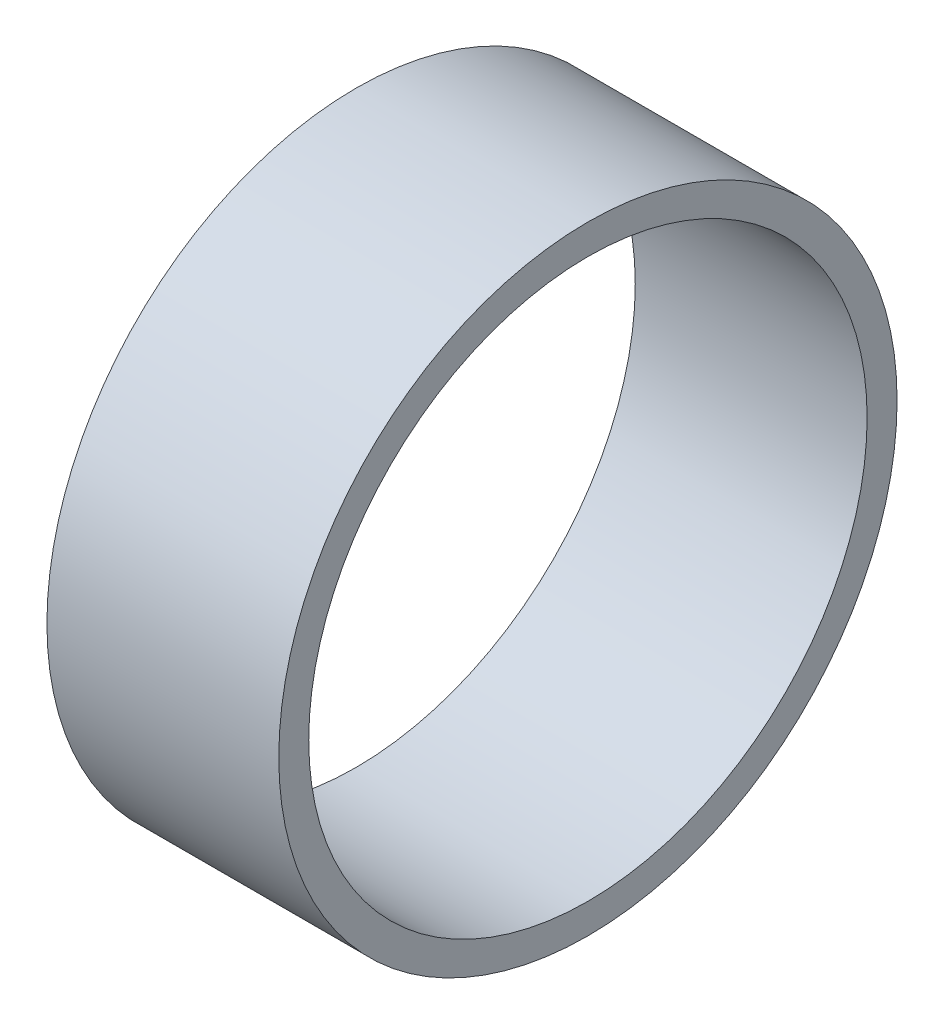
ISO-10303-21;
HEADER;
FILE_DESCRIPTION(('STEP AP214'),'2;1');
FILE_NAME('part.step','',(''),(''),'','','');
FILE_SCHEMA(('AUTOMOTIVE_DESIGN { 1 0 10303 214 1 1 1 1 }'));
ENDSEC;
DATA;
#1=APPLICATION_CONTEXT('core data for automotive mechanical design processes');
#2=APPLICATION_PROTOCOL_DEFINITION('international standard','automotive_design',2000,#1);
#3=PRODUCT_CONTEXT('',#1,'mechanical');
#4=PRODUCT('Part','Part','',(#3));
#5=PRODUCT_RELATED_PRODUCT_CATEGORY('part','',(#4));
#6=PRODUCT_DEFINITION_FORMATION('','',#4);
#7=PRODUCT_DEFINITION_CONTEXT('part definition',#1,'design');
#8=PRODUCT_DEFINITION('design','',#6,#7);
#9=PRODUCT_DEFINITION_SHAPE('','',#8);
#10=(LENGTH_UNIT() NAMED_UNIT(*) SI_UNIT(.MILLI.,.METRE.));
#11=(NAMED_UNIT(*) PLANE_ANGLE_UNIT() SI_UNIT($,.RADIAN.));
#12=(NAMED_UNIT(*) SI_UNIT($,.STERADIAN.) SOLID_ANGLE_UNIT());
#13=UNCERTAINTY_MEASURE_WITH_UNIT(LENGTH_MEASURE(1.E-05),#10,'distance_accuracy_value','');
#14=(GEOMETRIC_REPRESENTATION_CONTEXT(3) GLOBAL_UNCERTAINTY_ASSIGNED_CONTEXT((#13)) GLOBAL_UNIT_ASSIGNED_CONTEXT((#10,
#11,#12)) REPRESENTATION_CONTEXT('',''));
#15=CARTESIAN_POINT('',(0.,0.,0.));
#16=DIRECTION('',(0.,0.,1.));
#17=DIRECTION('',(1.,0.,0.));
#18=AXIS2_PLACEMENT_3D('',#15,#16,#17);
#19=CARTESIAN_POINT('',(0.,0.,0.));
#20=DIRECTION('',(1.,0.,0.));
#21=DIRECTION('',(0.,1.,0.));
#22=AXIS2_PLACEMENT_3D('',#19,#20,#21);
#23=PLANE('',#22);
#24=CARTESIAN_POINT('',(0.,0.,0.));
#25=DIRECTION('',(-1.,0.,0.));
#26=DIRECTION('',(0.,-1.,0.));
#27=AXIS2_PLACEMENT_3D('',#24,#25,#26);
#28=CIRCLE('',#27,14.45);
#29=CARTESIAN_POINT('',(0.,14.45,0.));
#30=VERTEX_POINT('',#29);
#31=EDGE_CURVE('E59',#30,#30,#28,.T.);
#32=ORIENTED_EDGE('',*,*,#31,.F.);
#33=EDGE_LOOP('',(#32));
#34=FACE_BOUND('',#33,.T.);
#35=CARTESIAN_POINT('',(0.,0.,0.));
#36=DIRECTION('',(1.,0.,0.));
#37=DIRECTION('',(0.,1.,0.));
#38=AXIS2_PLACEMENT_3D('',#35,#36,#37);
#39=CIRCLE('',#38,16.);
#40=CARTESIAN_POINT('',(0.,-16.,0.));
#41=VERTEX_POINT('',#40);
#42=EDGE_CURVE('E11',#41,#41,#39,.T.);
#43=ORIENTED_EDGE('',*,*,#42,.F.);
#44=EDGE_LOOP('',(#43));
#45=FACE_BOUND('',#44,.T.);
#46=ADVANCED_FACE('F17',(#34,#45),#23,.F.);
#47=CARTESIAN_POINT('',(12.,0.,0.));
#48=DIRECTION('',(1.,0.,0.));
#49=DIRECTION('',(0.,1.,0.));
#50=AXIS2_PLACEMENT_3D('',#47,#48,#49);
#51=PLANE('',#50);
#52=CARTESIAN_POINT('',(12.,0.,0.));
#53=DIRECTION('',(-1.,0.,0.));
#54=DIRECTION('',(0.,-1.,0.));
#55=AXIS2_PLACEMENT_3D('',#52,#53,#54);
#56=CIRCLE('',#55,14.45);
#57=CARTESIAN_POINT('',(12.,14.45,0.));
#58=VERTEX_POINT('',#57);
#59=EDGE_CURVE('E57',#58,#58,#56,.T.);
#60=ORIENTED_EDGE('',*,*,#59,.T.);
#61=EDGE_LOOP('',(#60));
#62=FACE_BOUND('',#61,.T.);
#63=CARTESIAN_POINT('',(12.,0.,0.));
#64=DIRECTION('',(1.,0.,0.));
#65=DIRECTION('',(0.,1.,0.));
#66=AXIS2_PLACEMENT_3D('',#63,#64,#65);
#67=CIRCLE('',#66,16.);
#68=CARTESIAN_POINT('',(12.,-16.,0.));
#69=VERTEX_POINT('',#68);
#70=EDGE_CURVE('E71',#69,#69,#67,.T.);
#71=ORIENTED_EDGE('',*,*,#70,.T.);
#72=EDGE_LOOP('',(#71));
#73=FACE_BOUND('',#72,.T.);
#74=ADVANCED_FACE('F62',(#62,#73),#51,.T.);
#75=CARTESIAN_POINT('',(0.,0.,0.));
#76=DIRECTION('',(1.,0.,0.));
#77=DIRECTION('',(0.,1.,0.));
#78=AXIS2_PLACEMENT_3D('',#75,#76,#77);
#79=CYLINDRICAL_SURFACE('',#78,16.);
#80=ORIENTED_EDGE('',*,*,#70,.F.);
#81=DIRECTION('',(-1.,0.,0.));
#82=VECTOR('',#81,1.);
#83=CARTESIAN_POINT('',(0.,-16.,0.));
#84=LINE('',#83,#82);
#85=EDGE_CURVE('E27',#69,#41,#84,.T.);
#86=ORIENTED_EDGE('',*,*,#85,.T.);
#87=ORIENTED_EDGE('',*,*,#42,.T.);
#88=ORIENTED_EDGE('',*,*,#85,.F.);
#89=EDGE_LOOP('',(#80,#86,#87,#88));
#90=FACE_BOUND('',#89,.T.);
#91=ADVANCED_FACE('F19',(#90),#79,.T.);
#92=CARTESIAN_POINT('',(0.,0.,0.));
#93=DIRECTION('',(1.,0.,0.));
#94=DIRECTION('',(0.,-1.,0.));
#95=AXIS2_PLACEMENT_3D('',#92,#93,#94);
#96=CYLINDRICAL_SURFACE('',#95,14.45);
#97=ORIENTED_EDGE('',*,*,#59,.F.);
#98=DIRECTION('',(-1.,0.,0.));
#99=VECTOR('',#98,1.);
#100=CARTESIAN_POINT('',(0.,14.45,0.));
#101=LINE('',#100,#99);
#102=EDGE_CURVE('E21',#58,#30,#101,.T.);
#103=ORIENTED_EDGE('',*,*,#102,.T.);
#104=ORIENTED_EDGE('',*,*,#31,.T.);
#105=ORIENTED_EDGE('',*,*,#102,.F.);
#106=EDGE_LOOP('',(#97,#103,#104,#105));
#107=FACE_BOUND('',#106,.T.);
#108=ADVANCED_FACE('F56',(#107),#96,.F.);
#109=CLOSED_SHELL('',(#46,#74,#91,#108));
#110=MANIFOLD_SOLID_BREP('B1',#109);
#111=ADVANCED_BREP_SHAPE_REPRESENTATION('',(#18,#110),#14);
#112=SHAPE_DEFINITION_REPRESENTATION(#9,#111);
ENDSEC;
END-ISO-10303-21;
